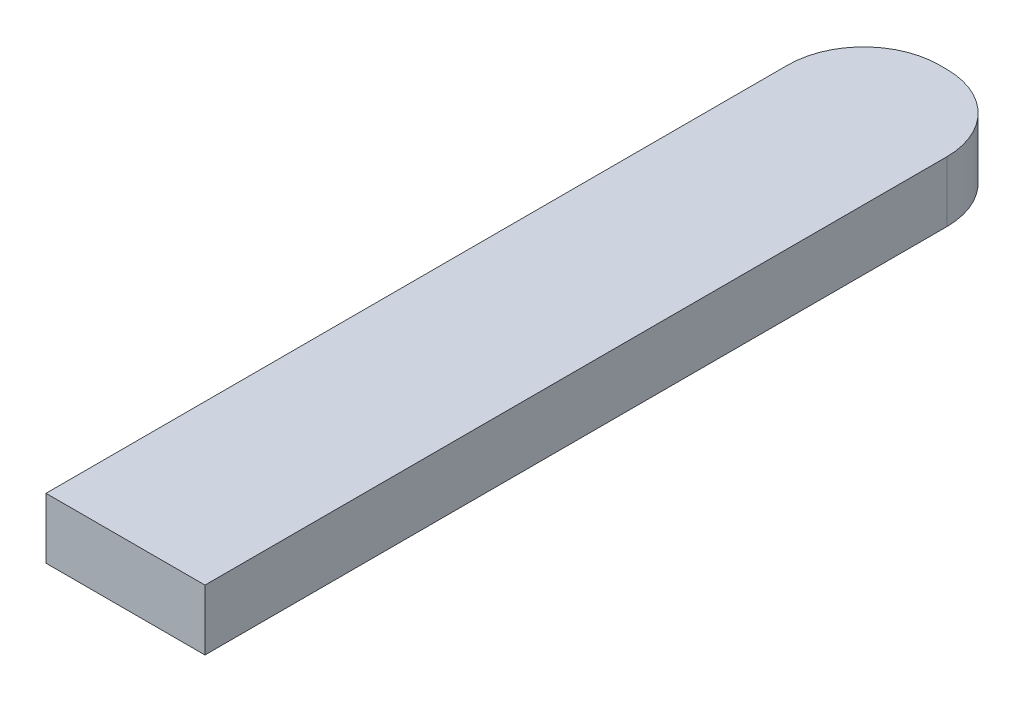
ISO-10303-21;
HEADER;
FILE_DESCRIPTION(('STEP AP214'),'2;1');
FILE_NAME('part.step','',(''),(''),'','','');
FILE_SCHEMA(('AUTOMOTIVE_DESIGN { 1 0 10303 214 1 1 1 1 }'));
ENDSEC;
DATA;
#1=APPLICATION_CONTEXT('core data for automotive mechanical design processes');
#2=APPLICATION_PROTOCOL_DEFINITION('international standard','automotive_design',2000,#1);
#3=PRODUCT_CONTEXT('',#1,'mechanical');
#4=PRODUCT('Part','Part','',(#3));
#5=PRODUCT_RELATED_PRODUCT_CATEGORY('part','',(#4));
#6=PRODUCT_DEFINITION_FORMATION('','',#4);
#7=PRODUCT_DEFINITION_CONTEXT('part definition',#1,'design');
#8=PRODUCT_DEFINITION('design','',#6,#7);
#9=PRODUCT_DEFINITION_SHAPE('','',#8);
#10=(LENGTH_UNIT() NAMED_UNIT(*) SI_UNIT(.MILLI.,.METRE.));
#11=(NAMED_UNIT(*) PLANE_ANGLE_UNIT() SI_UNIT($,.RADIAN.));
#12=(NAMED_UNIT(*) SI_UNIT($,.STERADIAN.) SOLID_ANGLE_UNIT());
#13=UNCERTAINTY_MEASURE_WITH_UNIT(LENGTH_MEASURE(1.E-05),#10,'distance_accuracy_value','');
#14=(GEOMETRIC_REPRESENTATION_CONTEXT(3) GLOBAL_UNCERTAINTY_ASSIGNED_CONTEXT((#13)) GLOBAL_UNIT_ASSIGNED_CONTEXT((#10,
#11,#12)) REPRESENTATION_CONTEXT('',''));
#15=CARTESIAN_POINT('',(0.,0.,0.));
#16=DIRECTION('',(0.,0.,1.));
#17=DIRECTION('',(1.,0.,0.));
#18=AXIS2_PLACEMENT_3D('',#15,#16,#17);
#19=CARTESIAN_POINT('',(0.525,-0.2,0.));
#20=DIRECTION('',(0.,-1.,0.));
#21=DIRECTION('',(0.,0.,-1.));
#22=AXIS2_PLACEMENT_3D('',#19,#20,#21);
#23=PLANE('',#22);
#24=DIRECTION('',(1.,0.,0.));
#25=VECTOR('',#24,1.);
#26=CARTESIAN_POINT('',(0.525,-0.2,0.));
#27=LINE('',#26,#25);
#28=CARTESIAN_POINT('',(-0.025,-0.2,0.));
#29=VERTEX_POINT('',#28);
#30=CARTESIAN_POINT('',(0.024999999999995,-0.2,0.));
#31=VERTEX_POINT('',#30);
#32=EDGE_CURVE('E67',#29,#31,#27,.T.);
#33=ORIENTED_EDGE('',*,*,#32,.T.);
#34=CARTESIAN_POINT('',(0.025,-0.2,0.5));
#35=DIRECTION('',(0.,-1.,0.));
#36=DIRECTION('',(0.,0.,-1.));
#37=AXIS2_PLACEMENT_3D('',#34,#35,#36);
#38=CIRCLE('',#37,0.5);
#39=CARTESIAN_POINT('',(0.525,-0.2,0.5));
#40=VERTEX_POINT('',#39);
#41=EDGE_CURVE('E78',#31,#40,#38,.T.);
#42=ORIENTED_EDGE('',*,*,#41,.T.);
#43=DIRECTION('',(0.,0.,-1.));
#44=VECTOR('',#43,1.);
#45=CARTESIAN_POINT('',(0.525,-0.2,0.));
#46=LINE('',#45,#44);
#47=CARTESIAN_POINT('',(0.525,-0.2,5.4));
#48=VERTEX_POINT('',#47);
#49=EDGE_CURVE('E94',#48,#40,#46,.T.);
#50=ORIENTED_EDGE('',*,*,#49,.F.);
#51=DIRECTION('',(1.,0.,0.));
#52=VECTOR('',#51,1.);
#53=CARTESIAN_POINT('',(-0.525,-0.2,5.4));
#54=LINE('',#53,#52);
#55=CARTESIAN_POINT('',(-0.525,-0.2,5.4));
#56=VERTEX_POINT('',#55);
#57=EDGE_CURVE('E73',#56,#48,#54,.T.);
#58=ORIENTED_EDGE('',*,*,#57,.F.);
#59=DIRECTION('',(0.,0.,1.));
#60=VECTOR('',#59,1.);
#61=CARTESIAN_POINT('',(-0.525,-0.2,0.));
#62=LINE('',#61,#60);
#63=CARTESIAN_POINT('',(-0.525,-0.2,0.5));
#64=VERTEX_POINT('',#63);
#65=EDGE_CURVE('E70',#64,#56,#62,.T.);
#66=ORIENTED_EDGE('',*,*,#65,.F.);
#67=CARTESIAN_POINT('',(-0.025,-0.2,0.5));
#68=DIRECTION('',(0.,1.,0.));
#69=DIRECTION('',(0.,0.,1.));
#70=AXIS2_PLACEMENT_3D('',#67,#68,#69);
#71=CIRCLE('',#70,0.5);
#72=EDGE_CURVE('E19',#64,#29,#71,.F.);
#73=ORIENTED_EDGE('',*,*,#72,.T.);
#74=EDGE_LOOP('',(#33,#42,#50,#58,#66,#73));
#75=FACE_BOUND('',#74,.T.);
#76=ADVANCED_FACE('F16',(#75),#23,.T.);
#77=CARTESIAN_POINT('',(-0.525,-0.2,0.));
#78=DIRECTION('',(-1.,0.,0.));
#79=DIRECTION('',(0.,0.,1.));
#80=AXIS2_PLACEMENT_3D('',#77,#78,#79);
#81=PLANE('',#80);
#82=DIRECTION('',(0.,0.,1.));
#83=VECTOR('',#82,1.);
#84=CARTESIAN_POINT('',(-0.525,0.2,0.));
#85=LINE('',#84,#83);
#86=CARTESIAN_POINT('',(-0.525,0.2,0.5));
#87=VERTEX_POINT('',#86);
#88=CARTESIAN_POINT('',(-0.525,0.2,5.4));
#89=VERTEX_POINT('',#88);
#90=EDGE_CURVE('E82',#87,#89,#85,.T.);
#91=ORIENTED_EDGE('',*,*,#90,.F.);
#92=DIRECTION('',(0.,1.,0.));
#93=VECTOR('',#92,1.);
#94=CARTESIAN_POINT('',(-0.525,-0.2,0.5));
#95=LINE('',#94,#93);
#96=EDGE_CURVE('E64',#64,#87,#95,.T.);
#97=ORIENTED_EDGE('',*,*,#96,.F.);
#98=ORIENTED_EDGE('',*,*,#65,.T.);
#99=DIRECTION('',(0.,1.,0.));
#100=VECTOR('',#99,1.);
#101=CARTESIAN_POINT('',(-0.525,0.2,5.4));
#102=LINE('',#101,#100);
#103=EDGE_CURVE('E77',#89,#56,#102,.F.);
#104=ORIENTED_EDGE('',*,*,#103,.F.);
#105=EDGE_LOOP('',(#91,#97,#98,#104));
#106=FACE_BOUND('',#105,.T.);
#107=ADVANCED_FACE('F80',(#106),#81,.T.);
#108=CARTESIAN_POINT('',(-0.525,0.2,5.4));
#109=DIRECTION('',(0.,0.,1.));
#110=DIRECTION('',(1.,0.,0.));
#111=AXIS2_PLACEMENT_3D('',#108,#109,#110);
#112=PLANE('',#111);
#113=DIRECTION('',(0.,1.,0.));
#114=VECTOR('',#113,1.);
#115=CARTESIAN_POINT('',(0.525,0.2,5.4));
#116=LINE('',#115,#114);
#117=CARTESIAN_POINT('',(0.525,0.2,5.4));
#118=VERTEX_POINT('',#117);
#119=EDGE_CURVE('E95',#118,#48,#116,.F.);
#120=ORIENTED_EDGE('',*,*,#119,.F.);
#121=DIRECTION('',(1.,0.,0.));
#122=VECTOR('',#121,1.);
#123=CARTESIAN_POINT('',(-0.525,0.2,5.4));
#124=LINE('',#123,#122);
#125=EDGE_CURVE('E100',#89,#118,#124,.T.);
#126=ORIENTED_EDGE('',*,*,#125,.F.);
#127=ORIENTED_EDGE('',*,*,#103,.T.);
#128=ORIENTED_EDGE('',*,*,#57,.T.);
#129=EDGE_LOOP('',(#120,#126,#127,#128));
#130=FACE_BOUND('',#129,.T.);
#131=ADVANCED_FACE('F141',(#130),#112,.T.);
#132=CARTESIAN_POINT('',(0.525,0.2,0.));
#133=DIRECTION('',(1.,0.,0.));
#134=DIRECTION('',(0.,0.,-1.));
#135=AXIS2_PLACEMENT_3D('',#132,#133,#134);
#136=PLANE('',#135);
#137=ORIENTED_EDGE('',*,*,#49,.T.);
#138=DIRECTION('',(0.,-1.,0.));
#139=VECTOR('',#138,1.);
#140=CARTESIAN_POINT('',(0.525,0.2,0.5));
#141=LINE('',#140,#139);
#142=CARTESIAN_POINT('',(0.525,0.2,0.5));
#143=VERTEX_POINT('',#142);
#144=EDGE_CURVE('E86',#143,#40,#141,.T.);
#145=ORIENTED_EDGE('',*,*,#144,.F.);
#146=DIRECTION('',(0.,0.,1.));
#147=VECTOR('',#146,1.);
#148=CARTESIAN_POINT('',(0.525,0.2,0.));
#149=LINE('',#148,#147);
#150=EDGE_CURVE('E103',#118,#143,#149,.F.);
#151=ORIENTED_EDGE('',*,*,#150,.F.);
#152=ORIENTED_EDGE('',*,*,#119,.T.);
#153=EDGE_LOOP('',(#137,#145,#151,#152));
#154=FACE_BOUND('',#153,.T.);
#155=ADVANCED_FACE('F124',(#154),#136,.T.);
#156=CARTESIAN_POINT('',(0.025,0.2,0.5));
#157=DIRECTION('',(0.,-1.,0.));
#158=DIRECTION('',(0.,0.,-1.));
#159=AXIS2_PLACEMENT_3D('',#156,#157,#158);
#160=CYLINDRICAL_SURFACE('',#159,0.5);
#161=DIRECTION('',(0.,1.,0.));
#162=VECTOR('',#161,1.);
#163=CARTESIAN_POINT('',(0.02499999999999,0.2,0.));
#164=LINE('',#163,#162);
#165=CARTESIAN_POINT('',(0.024999999999995,0.2,0.));
#166=VERTEX_POINT('',#165);
#167=EDGE_CURVE('E83',#31,#166,#164,.T.);
#168=ORIENTED_EDGE('',*,*,#167,.T.);
#169=CARTESIAN_POINT('',(0.025,0.2,0.5));
#170=DIRECTION('',(0.,-1.,0.));
#171=DIRECTION('',(0.,0.,-1.));
#172=AXIS2_PLACEMENT_3D('',#169,#170,#171);
#173=CIRCLE('',#172,0.5);
#174=EDGE_CURVE('E119',#143,#166,#173,.F.);
#175=ORIENTED_EDGE('',*,*,#174,.F.);
#176=ORIENTED_EDGE('',*,*,#144,.T.);
#177=ORIENTED_EDGE('',*,*,#41,.F.);
#178=EDGE_LOOP('',(#168,#175,#176,#177));
#179=FACE_BOUND('',#178,.T.);
#180=ADVANCED_FACE('F128',(#179),#160,.T.);
#181=CARTESIAN_POINT('',(-0.525,0.2,0.));
#182=DIRECTION('',(0.,0.,1.));
#183=DIRECTION('',(1.,0.,0.));
#184=AXIS2_PLACEMENT_3D('',#181,#182,#183);
#185=PLANE('',#184);
#186=ORIENTED_EDGE('',*,*,#32,.F.);
#187=DIRECTION('',(0.,1.,0.));
#188=VECTOR('',#187,1.);
#189=CARTESIAN_POINT('',(-0.0249999999999999,-0.2,0.));
#190=LINE('',#189,#188);
#191=CARTESIAN_POINT('',(-0.025,0.2,0.));
#192=VERTEX_POINT('',#191);
#193=EDGE_CURVE('E34',#192,#29,#190,.F.);
#194=ORIENTED_EDGE('',*,*,#193,.F.);
#195=DIRECTION('',(1.,0.,0.));
#196=VECTOR('',#195,1.);
#197=CARTESIAN_POINT('',(-0.525,0.2,0.));
#198=LINE('',#197,#196);
#199=EDGE_CURVE('E25',#166,#192,#198,.F.);
#200=ORIENTED_EDGE('',*,*,#199,.F.);
#201=ORIENTED_EDGE('',*,*,#167,.F.);
#202=EDGE_LOOP('',(#186,#194,#200,#201));
#203=FACE_BOUND('',#202,.T.);
#204=ADVANCED_FACE('F155',(#203),#185,.F.);
#205=CARTESIAN_POINT('',(-0.025,-0.2,0.5));
#206=DIRECTION('',(0.,1.,0.));
#207=DIRECTION('',(0.,0.,1.));
#208=AXIS2_PLACEMENT_3D('',#205,#206,#207);
#209=CYLINDRICAL_SURFACE('',#208,0.5);
#210=ORIENTED_EDGE('',*,*,#193,.T.);
#211=ORIENTED_EDGE('',*,*,#72,.F.);
#212=ORIENTED_EDGE('',*,*,#96,.T.);
#213=CARTESIAN_POINT('',(-0.025,0.2,0.5));
#214=DIRECTION('',(0.,1.,0.));
#215=DIRECTION('',(0.,0.,1.));
#216=AXIS2_PLACEMENT_3D('',#213,#214,#215);
#217=CIRCLE('',#216,0.5);
#218=EDGE_CURVE('E10',#192,#87,#217,.T.);
#219=ORIENTED_EDGE('',*,*,#218,.F.);
#220=EDGE_LOOP('',(#210,#211,#212,#219));
#221=FACE_BOUND('',#220,.T.);
#222=ADVANCED_FACE('F62',(#221),#209,.T.);
#223=CARTESIAN_POINT('',(-0.525,0.2,0.));
#224=DIRECTION('',(0.,1.,0.));
#225=DIRECTION('',(0.,0.,1.));
#226=AXIS2_PLACEMENT_3D('',#223,#224,#225);
#227=PLANE('',#226);
#228=ORIENTED_EDGE('',*,*,#199,.T.);
#229=ORIENTED_EDGE('',*,*,#218,.T.);
#230=ORIENTED_EDGE('',*,*,#90,.T.);
#231=ORIENTED_EDGE('',*,*,#125,.T.);
#232=ORIENTED_EDGE('',*,*,#150,.T.);
#233=ORIENTED_EDGE('',*,*,#174,.T.);
#234=EDGE_LOOP('',(#228,#229,#230,#231,#232,#233));
#235=FACE_BOUND('',#234,.T.);
#236=ADVANCED_FACE('F132',(#235),#227,.T.);
#237=CLOSED_SHELL('',(#76,#107,#131,#155,#180,#204,#222,#236));
#238=MANIFOLD_SOLID_BREP('B1',#237);
#239=ADVANCED_BREP_SHAPE_REPRESENTATION('',(#18,#238),#14);
#240=SHAPE_DEFINITION_REPRESENTATION(#9,#239);
ENDSEC;
END-ISO-10303-21;
